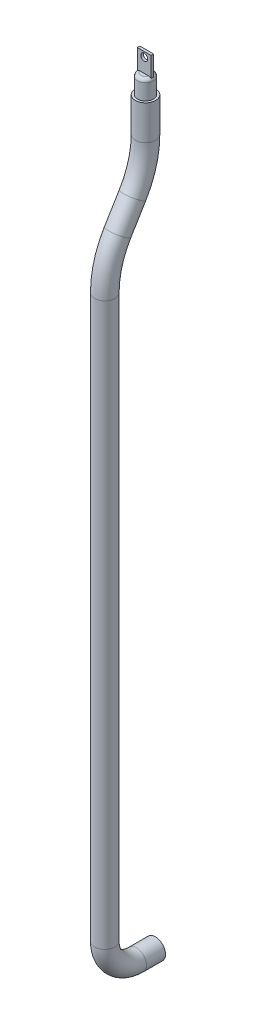
ISO-10303-21;
HEADER;
FILE_DESCRIPTION(('STEP AP214'),'2;1');
FILE_NAME('part.step','',(''),(''),'','','');
FILE_SCHEMA(('AUTOMOTIVE_DESIGN { 1 0 10303 214 1 1 1 1 }'));
ENDSEC;
DATA;
#1=APPLICATION_CONTEXT('core data for automotive mechanical design processes');
#2=APPLICATION_PROTOCOL_DEFINITION('international standard','automotive_design',2000,#1);
#3=PRODUCT_CONTEXT('',#1,'mechanical');
#4=PRODUCT('Part','Part','',(#3));
#5=PRODUCT_RELATED_PRODUCT_CATEGORY('part','',(#4));
#6=PRODUCT_DEFINITION_FORMATION('','',#4);
#7=PRODUCT_DEFINITION_CONTEXT('part definition',#1,'design');
#8=PRODUCT_DEFINITION('design','',#6,#7);
#9=PRODUCT_DEFINITION_SHAPE('','',#8);
#10=(LENGTH_UNIT() NAMED_UNIT(*) SI_UNIT(.MILLI.,.METRE.));
#11=(NAMED_UNIT(*) PLANE_ANGLE_UNIT() SI_UNIT($,.RADIAN.));
#12=(NAMED_UNIT(*) SI_UNIT($,.STERADIAN.) SOLID_ANGLE_UNIT());
#13=UNCERTAINTY_MEASURE_WITH_UNIT(LENGTH_MEASURE(1.E-05),#10,'distance_accuracy_value','');
#14=(GEOMETRIC_REPRESENTATION_CONTEXT(3) GLOBAL_UNCERTAINTY_ASSIGNED_CONTEXT((#13)) GLOBAL_UNIT_ASSIGNED_CONTEXT((#10,
#11,#12)) REPRESENTATION_CONTEXT('',''));
#15=CARTESIAN_POINT('',(0.,0.,0.));
#16=DIRECTION('',(0.,0.,1.));
#17=DIRECTION('',(1.,0.,0.));
#18=AXIS2_PLACEMENT_3D('',#15,#16,#17);
#19=CARTESIAN_POINT('',(1505.09003220834,-521.240046141747,2179.52103966599));
#20=DIRECTION('',(0.,1.,0.));
#21=DIRECTION('',(0.,0.,1.));
#22=AXIS2_PLACEMENT_3D('',#19,#20,#21);
#23=PLANE('',#22);
#24=DIRECTION('',(1.,0.,0.));
#25=VECTOR('',#24,1.);
#26=CARTESIAN_POINT('',(1516.09003220834,-521.240046141747,2181.52103966599));
#27=LINE('',#26,#25);
#28=CARTESIAN_POINT('',(1497.9005328159,-521.240046141747,2181.52103966599));
#29=VERTEX_POINT('',#28);
#30=CARTESIAN_POINT('',(1512.27953160078,-521.240046141747,2181.52103966599));
#31=VERTEX_POINT('',#30);
#32=EDGE_CURVE('E127',#29,#31,#27,.T.);
#33=ORIENTED_EDGE('',*,*,#32,.F.);
#34=CARTESIAN_POINT('',(1505.09003220834,-521.240046141747,2179.52103966599));
#35=DIRECTION('',(0.,1.,0.));
#36=DIRECTION('',(0.,0.,1.));
#37=AXIS2_PLACEMENT_3D('',#34,#35,#36);
#38=CIRCLE('',#37,7.46249968267053);
#39=EDGE_CURVE('E171',#29,#31,#38,.T.);
#40=ORIENTED_EDGE('',*,*,#39,.T.);
#41=EDGE_LOOP('',(#33,#40));
#42=FACE_BOUND('',#41,.T.);
#43=ADVANCED_FACE('F44',(#42),#23,.T.);
#44=CARTESIAN_POINT('',(1505.09003220834,-551.240046141747,2179.52103966599));
#45=DIRECTION('',(0.,1.,0.));
#46=DIRECTION('',(1.,0.,0.));
#47=AXIS2_PLACEMENT_3D('',#44,#45,#46);
#48=PLANE('',#47);
#49=CARTESIAN_POINT('',(1505.09003220834,-551.240046141747,2179.52103966599));
#50=DIRECTION('',(0.,1.,0.));
#51=DIRECTION('',(0.,0.,1.));
#52=AXIS2_PLACEMENT_3D('',#49,#50,#51);
#53=CIRCLE('',#52,12.4624996826705);
#54=CARTESIAN_POINT('',(1505.09003220834,-551.240046141747,2191.98353934866));
#55=VERTEX_POINT('',#54);
#56=EDGE_CURVE('E142',#55,#55,#53,.T.);
#57=ORIENTED_EDGE('',*,*,#56,.F.);
#58=EDGE_LOOP('',(#57));
#59=FACE_BOUND('',#58,.T.);
#60=CARTESIAN_POINT('',(1505.09003220834,-551.240046141747,2179.52103966599));
#61=DIRECTION('',(0.,1.,0.));
#62=DIRECTION('',(1.,0.,0.));
#63=AXIS2_PLACEMENT_3D('',#60,#61,#62);
#64=CIRCLE('',#63,16.);
#65=CARTESIAN_POINT('',(1521.09003220834,-551.240046141747,2179.52103966599));
#66=VERTEX_POINT('',#65);
#67=EDGE_CURVE('E146',#66,#66,#64,.T.);
#68=ORIENTED_EDGE('',*,*,#67,.T.);
#69=EDGE_LOOP('',(#68));
#70=FACE_BOUND('',#69,.T.);
#71=ADVANCED_FACE('F228',(#59,#70),#48,.T.);
#72=CARTESIAN_POINT('',(1505.09003220834,-1727.61527839752,2163.87371588675));
#73=DIRECTION('',(0.,0.,1.));
#74=DIRECTION('',(1.,0.,0.));
#75=AXIS2_PLACEMENT_3D('',#72,#73,#74);
#76=PLANE('',#75);
#77=CARTESIAN_POINT('',(1505.09003220834,-1727.61527839752,2163.87371588675));
#78=DIRECTION('',(0.,0.,1.));
#79=DIRECTION('',(1.,0.,0.));
#80=AXIS2_PLACEMENT_3D('',#77,#78,#79);
#81=CIRCLE('',#80,16.);
#82=CARTESIAN_POINT('',(1521.09003220834,-1727.61527839752,2163.87371588675));
#83=VERTEX_POINT('',#82);
#84=EDGE_CURVE('E167',#83,#83,#81,.T.);
#85=ORIENTED_EDGE('',*,*,#84,.F.);
#86=EDGE_LOOP('',(#85));
#87=FACE_BOUND('',#86,.T.);
#88=ADVANCED_FACE('F233',(#87),#76,.F.);
#89=CARTESIAN_POINT('',(1505.09003220834,-551.240046141747,2179.52103966599));
#90=DIRECTION('',(0.,-1.,0.));
#91=DIRECTION('',(0.,0.,-1.));
#92=AXIS2_PLACEMENT_3D('',#89,#90,#91);
#93=CYLINDRICAL_SURFACE('',#92,16.);
#94=CARTESIAN_POINT('',(1505.09003220834,-605.83928582164,2179.52103966599));
#95=DIRECTION('',(0.,1.,0.));
#96=DIRECTION('',(1.,0.,0.));
#97=AXIS2_PLACEMENT_3D('',#94,#95,#96);
#98=CIRCLE('',#97,16.);
#99=CARTESIAN_POINT('',(1505.09003220834,-605.83928582164,2163.52103966599));
#100=VERTEX_POINT('',#99);
#101=EDGE_CURVE('E149',#100,#100,#98,.T.);
#102=ORIENTED_EDGE('',*,*,#101,.T.);
#103=EDGE_LOOP('',(#102));
#104=FACE_BOUND('',#103,.T.);
#105=ORIENTED_EDGE('',*,*,#67,.F.);
#106=EDGE_LOOP('',(#105));
#107=FACE_BOUND('',#106,.T.);
#108=ADVANCED_FACE('F229',(#104,#107),#93,.T.);
#109=CARTESIAN_POINT('',(1505.09003220833,-605.83928582164,2319.52103966599));
#110=DIRECTION('',(-1.,0.,0.));
#111=DIRECTION('',(0.,0.,1.));
#112=AXIS2_PLACEMENT_3D('',#109,#110,#111);
#113=TOROIDAL_SURFACE('',#112,140.,16.);
#114=CARTESIAN_POINT('',(1505.09003220833,-678.52699635586,2199.86947579283));
#115=DIRECTION('',(0.,0.854654027665447,-0.519197932387282));
#116=DIRECTION('',(1.,0.,0.));
#117=AXIS2_PLACEMENT_3D('',#114,#115,#116);
#118=CIRCLE('',#117,16.);
#119=CARTESIAN_POINT('',(1505.09003220833,-686.834163274056,2186.19501135018));
#120=VERTEX_POINT('',#119);
#121=EDGE_CURVE('E152',#120,#120,#118,.T.);
#122=CARTESIAN_POINT('',(1505.09003220833,-605.83928582164,2319.52103966599));
#123=DIRECTION('',(-1.,0.,0.));
#124=DIRECTION('',(0.,0.,1.));
#125=AXIS2_PLACEMENT_3D('',#122,#123,#124);
#126=CIRCLE('',#125,156.);
#127=EDGE_CURVE('',#100,#120,#126,.T.);
#128=ORIENTED_EDGE('',*,*,#101,.F.);
#129=ORIENTED_EDGE('',*,*,#121,.T.);
#130=ORIENTED_EDGE('',*,*,#127,.T.);
#131=ORIENTED_EDGE('',*,*,#127,.F.);
#132=EDGE_LOOP('',(#128,#130,#129,#131));
#133=FACE_BOUND('',#132,.T.);
#134=ADVANCED_FACE('F232',(#133),#113,.T.);
#135=CARTESIAN_POINT('',(1505.09003220834,-678.52699635586,2199.86947579283));
#136=DIRECTION('',(0.,-0.854654027665449,0.51919793238728));
#137=DIRECTION('',(0.,-0.51919793238728,-0.854654027665449));
#138=AXIS2_PLACEMENT_3D('',#135,#136,#137);
#139=CYLINDRICAL_SURFACE('',#138,16.);
#140=CARTESIAN_POINT('',(1505.09003220834,-717.46692056775,2223.52527975991));
#141=DIRECTION('',(0.,0.854654027665449,-0.51919793238728));
#142=DIRECTION('',(1.,0.,0.));
#143=AXIS2_PLACEMENT_3D('',#140,#141,#142);
#144=CIRCLE('',#143,16.);
#145=CARTESIAN_POINT('',(1505.09003220833,-709.159753649553,2237.19974420255));
#146=VERTEX_POINT('',#145);
#147=EDGE_CURVE('E155',#146,#146,#144,.T.);
#148=ORIENTED_EDGE('',*,*,#147,.T.);
#149=EDGE_LOOP('',(#148));
#150=FACE_BOUND('',#149,.T.);
#151=ORIENTED_EDGE('',*,*,#121,.F.);
#152=EDGE_LOOP('',(#151));
#153=FACE_BOUND('',#152,.T.);
#154=ADVANCED_FACE('F237',(#150,#153),#139,.T.);
#155=CARTESIAN_POINT('',(1505.09003220834,-790.154631101969,2103.87371588675));
#156=DIRECTION('',(1.,0.,0.));
#157=DIRECTION('',(0.,0.,-1.));
#158=AXIS2_PLACEMENT_3D('',#155,#156,#157);
#159=TOROIDAL_SURFACE('',#158,140.,16.);
#160=CARTESIAN_POINT('',(1505.09003220834,-790.154631101969,2243.87371588675));
#161=DIRECTION('',(0.,1.,0.));
#162=DIRECTION('',(1.,0.,0.));
#163=AXIS2_PLACEMENT_3D('',#160,#161,#162);
#164=CIRCLE('',#163,16.);
#165=CARTESIAN_POINT('',(1505.09003220834,-790.154631101969,2259.87371588675));
#166=VERTEX_POINT('',#165);
#167=EDGE_CURVE('E158',#166,#166,#164,.T.);
#168=CARTESIAN_POINT('',(1505.09003220834,-790.154631101969,2103.87371588675));
#169=DIRECTION('',(1.,0.,0.));
#170=DIRECTION('',(0.,0.,-1.));
#171=AXIS2_PLACEMENT_3D('',#168,#169,#170);
#172=CIRCLE('',#171,156.);
#173=EDGE_CURVE('',#146,#166,#172,.T.);
#174=ORIENTED_EDGE('',*,*,#147,.F.);
#175=ORIENTED_EDGE('',*,*,#167,.T.);
#176=ORIENTED_EDGE('',*,*,#173,.T.);
#177=ORIENTED_EDGE('',*,*,#173,.F.);
#178=EDGE_LOOP('',(#174,#176,#175,#177));
#179=FACE_BOUND('',#178,.T.);
#180=ADVANCED_FACE('F241',(#179),#159,.T.);
#181=CARTESIAN_POINT('',(1505.09003220833,-790.154631101969,2243.87371588675));
#182=DIRECTION('',(0.,-1.,0.));
#183=DIRECTION('',(1.,0.,0.));
#184=AXIS2_PLACEMENT_3D('',#181,#182,#183);
#185=CYLINDRICAL_SURFACE('',#184,16.);
#186=CARTESIAN_POINT('',(1505.09003220834,-1677.61527839752,2243.87371588675));
#187=DIRECTION('',(0.,1.,0.));
#188=DIRECTION('',(1.,0.,0.));
#189=AXIS2_PLACEMENT_3D('',#186,#187,#188);
#190=CIRCLE('',#189,16.);
#191=CARTESIAN_POINT('',(1505.09003220834,-1677.61527839752,2259.87371588675));
#192=VERTEX_POINT('',#191);
#193=EDGE_CURVE('E161',#192,#192,#190,.T.);
#194=ORIENTED_EDGE('',*,*,#193,.T.);
#195=EDGE_LOOP('',(#194));
#196=FACE_BOUND('',#195,.T.);
#197=ORIENTED_EDGE('',*,*,#167,.F.);
#198=EDGE_LOOP('',(#197));
#199=FACE_BOUND('',#198,.T.);
#200=ADVANCED_FACE('F245',(#196,#199),#185,.T.);
#201=CARTESIAN_POINT('',(1505.09003220834,-1677.61527839752,2193.87371588675));
#202=DIRECTION('',(1.,0.,0.));
#203=DIRECTION('',(0.,0.,-1.));
#204=AXIS2_PLACEMENT_3D('',#201,#202,#203);
#205=TOROIDAL_SURFACE('',#204,49.9999999999998,16.);
#206=CARTESIAN_POINT('',(1505.09003220834,-1727.61527839752,2193.87371588675));
#207=DIRECTION('',(0.,0.,1.));
#208=DIRECTION('',(1.,0.,0.));
#209=AXIS2_PLACEMENT_3D('',#206,#207,#208);
#210=CIRCLE('',#209,16.);
#211=CARTESIAN_POINT('',(1505.09003220834,-1743.61527839752,2193.87371588675));
#212=VERTEX_POINT('',#211);
#213=EDGE_CURVE('E164',#212,#212,#210,.T.);
#214=CARTESIAN_POINT('',(1505.09003220834,-1677.61527839752,2193.87371588675));
#215=DIRECTION('',(1.,0.,0.));
#216=DIRECTION('',(0.,0.,-1.));
#217=AXIS2_PLACEMENT_3D('',#214,#215,#216);
#218=CIRCLE('',#217,65.9999999999998);
#219=EDGE_CURVE('',#192,#212,#218,.T.);
#220=ORIENTED_EDGE('',*,*,#193,.F.);
#221=ORIENTED_EDGE('',*,*,#213,.T.);
#222=ORIENTED_EDGE('',*,*,#219,.T.);
#223=ORIENTED_EDGE('',*,*,#219,.F.);
#224=EDGE_LOOP('',(#220,#222,#221,#223));
#225=FACE_BOUND('',#224,.T.);
#226=ADVANCED_FACE('F249',(#225),#205,.T.);
#227=CARTESIAN_POINT('',(1505.09003220834,-1727.61527839752,2193.87371588675));
#228=DIRECTION('',(0.,0.,-1.));
#229=DIRECTION('',(-1.,0.,0.));
#230=AXIS2_PLACEMENT_3D('',#227,#228,#229);
#231=CYLINDRICAL_SURFACE('',#230,16.);
#232=ORIENTED_EDGE('',*,*,#84,.T.);
#233=EDGE_LOOP('',(#232));
#234=FACE_BOUND('',#233,.T.);
#235=ORIENTED_EDGE('',*,*,#213,.F.);
#236=EDGE_LOOP('',(#235));
#237=FACE_BOUND('',#236,.T.);
#238=ADVANCED_FACE('F226',(#234,#237),#231,.T.);
#239=CARTESIAN_POINT('',(1505.09003220834,-521.240046141747,2179.52103966599));
#240=DIRECTION('',(0.,-1.,0.));
#241=DIRECTION('',(0.,0.,-1.));
#242=AXIS2_PLACEMENT_3D('',#239,#240,#241);
#243=CYLINDRICAL_SURFACE('',#242,12.4624996826705);
#244=CARTESIAN_POINT('',(1505.09003220834,-526.240046141747,2179.52103966599));
#245=DIRECTION('',(0.,1.,0.));
#246=DIRECTION('',(0.,0.,1.));
#247=AXIS2_PLACEMENT_3D('',#244,#245,#246);
#248=CIRCLE('',#247,12.4624996826705);
#249=CARTESIAN_POINT('',(1505.09003220834,-526.240046141747,2191.98353934866));
#250=VERTEX_POINT('',#249);
#251=EDGE_CURVE('E174',#250,#250,#248,.F.);
#252=ORIENTED_EDGE('',*,*,#251,.T.);
#253=EDGE_LOOP('',(#252));
#254=FACE_BOUND('',#253,.T.);
#255=ORIENTED_EDGE('',*,*,#56,.T.);
#256=EDGE_LOOP('',(#255));
#257=FACE_BOUND('',#256,.T.);
#258=ADVANCED_FACE('F222',(#254,#257),#243,.T.);
#259=DIRECTION('',(1.,0.,0.));
#260=VECTOR('',#259,1.);
#261=CARTESIAN_POINT('',(1516.09003220834,-521.240046141747,2177.52103966599));
#262=LINE('',#261,#260);
#263=CARTESIAN_POINT('',(1497.9005328159,-521.240046141747,2177.52103966599));
#264=VERTEX_POINT('',#263);
#265=CARTESIAN_POINT('',(1512.27953160078,-521.240046141747,2177.52103966599));
#266=VERTEX_POINT('',#265);
#267=EDGE_CURVE('E137',#264,#266,#262,.T.);
#268=ORIENTED_EDGE('',*,*,#267,.T.);
#269=CARTESIAN_POINT('',(1505.09003220834,-521.240046141747,2179.52103966599));
#270=DIRECTION('',(0.,1.,0.));
#271=DIRECTION('',(0.,0.,1.));
#272=AXIS2_PLACEMENT_3D('',#269,#270,#271);
#273=CIRCLE('',#272,7.46249968267053);
#274=EDGE_CURVE('E169',#266,#264,#273,.T.);
#275=ORIENTED_EDGE('',*,*,#274,.T.);
#276=EDGE_LOOP('',(#268,#275));
#277=FACE_BOUND('',#276,.T.);
#278=ADVANCED_FACE('F218',(#277),#23,.T.);
#279=CARTESIAN_POINT('',(1494.09003220834,-491.240046141747,2177.52103966599));
#280=DIRECTION('',(-1.,0.,0.));
#281=DIRECTION('',(0.,0.,1.));
#282=AXIS2_PLACEMENT_3D('',#279,#280,#281);
#283=PLANE('',#282);
#284=DIRECTION('',(0.,-1.,0.));
#285=VECTOR('',#284,1.);
#286=CARTESIAN_POINT('',(1494.09003220834,-491.240046141747,2177.52103966599));
#287=LINE('',#286,#285);
#288=CARTESIAN_POINT('',(1494.09003220834,-491.240046141747,2177.52103966599));
#289=VERTEX_POINT('',#288);
#290=CARTESIAN_POINT('',(1494.09003220834,-522.896744747712,2177.52103966599));
#291=VERTEX_POINT('',#290);
#292=EDGE_CURVE('E70',#289,#291,#287,.T.);
#293=ORIENTED_EDGE('',*,*,#292,.T.);
#294=CARTESIAN_POINT('',(1494.09003220834,-522.896744747712,2177.52103966599));
#295=CARTESIAN_POINT('',(1494.09003220834,-522.868079850711,2177.66525360418));
#296=CARTESIAN_POINT('',(1494.09003220834,-522.8429067719,2177.81013877408));
#297=CARTESIAN_POINT('',(1494.09003220834,-522.799182083621,2178.10087815217));
#298=CARTESIAN_POINT('',(1494.09003220834,-522.780629141573,2178.24673215931));
#299=CARTESIAN_POINT('',(1494.09003220834,-522.749755410663,2178.53924478151));
#300=CARTESIAN_POINT('',(1494.09003220834,-522.737441063178,2178.68590407078));
#301=CARTESIAN_POINT('',(1494.09003220834,-522.718855098255,2178.97960402014));
#302=CARTESIAN_POINT('',(1494.09003220834,-522.712583815116,2179.12664470088));
#303=CARTESIAN_POINT('',(1494.09003220834,-522.702733032429,2179.5631876573));
#304=CARTESIAN_POINT('',(1494.09003220834,-522.707624436793,2179.85291834135));
#305=CARTESIAN_POINT('',(1494.09003220834,-522.74056304714,2180.43087878731));
#306=CARTESIAN_POINT('',(1494.09003220834,-522.768590633227,2180.71910961279));
#307=CARTESIAN_POINT('',(1494.09003220834,-522.821425739803,2181.09168786679));
#308=CARTESIAN_POINT('',(1494.09003220834,-522.834790318635,2181.17772290416));
#309=CARTESIAN_POINT('',(1494.09003220834,-522.863932961985,2181.34959810684));
#310=CARTESIAN_POINT('',(1494.09003220834,-522.879716819959,2181.43543728859));
#311=CARTESIAN_POINT('',(1494.09003220834,-522.896744747712,2181.52103966599));
#312=B_SPLINE_CURVE_WITH_KNOTS('',3,(#294,#295,#296,#297,#298,#299,#300,#301,#302,#303,#304,
#305,#306,#307,#308,#309,#310,#311),.UNSPECIFIED.,.F.,.F.,(4,2,2,2,2,2,2,2,4),(0.,
0.441029170778469,0.881969515819635,1.3233642106153,1.76478332167139,2.63316613388809,
3.50081329748561,3.76198809996494,4.02379840257637),.UNSPECIFIED.);
#313=CARTESIAN_POINT('',(1494.09003220834,-522.896744747712,2181.52103966599));
#314=VERTEX_POINT('',#313);
#315=EDGE_CURVE('E57',#291,#314,#312,.T.);
#316=ORIENTED_EDGE('',*,*,#315,.T.);
#317=DIRECTION('',(0.,-1.,0.));
#318=VECTOR('',#317,1.);
#319=CARTESIAN_POINT('',(1494.09003220834,-491.240046141747,2181.52103966599));
#320=LINE('',#319,#318);
#321=CARTESIAN_POINT('',(1494.09003220834,-491.240046141747,2181.52103966599));
#322=VERTEX_POINT('',#321);
#323=EDGE_CURVE('E63',#322,#314,#320,.T.);
#324=ORIENTED_EDGE('',*,*,#323,.F.);
#325=DIRECTION('',(0.,0.,1.));
#326=VECTOR('',#325,1.);
#327=CARTESIAN_POINT('',(1494.09003220834,-491.240046141747,2177.52103966599));
#328=LINE('',#327,#326);
#329=EDGE_CURVE('E118',#289,#322,#328,.T.);
#330=ORIENTED_EDGE('',*,*,#329,.F.);
#331=EDGE_LOOP('',(#293,#316,#324,#330));
#332=FACE_BOUND('',#331,.T.);
#333=ADVANCED_FACE('F214',(#332),#283,.T.);
#334=CARTESIAN_POINT('',(1516.09003220834,-491.240046141747,2177.52103966599));
#335=DIRECTION('',(0.,1.,0.));
#336=DIRECTION('',(0.,0.,1.));
#337=AXIS2_PLACEMENT_3D('',#334,#335,#336);
#338=PLANE('',#337);
#339=ORIENTED_EDGE('',*,*,#329,.T.);
#340=DIRECTION('',(-1.,0.,0.));
#341=VECTOR('',#340,1.);
#342=CARTESIAN_POINT('',(1516.09003220834,-491.240046141747,2181.52103966599));
#343=LINE('',#342,#341);
#344=CARTESIAN_POINT('',(1516.09003220834,-491.240046141747,2181.52103966599));
#345=VERTEX_POINT('',#344);
#346=EDGE_CURVE('E123',#345,#322,#343,.T.);
#347=ORIENTED_EDGE('',*,*,#346,.F.);
#348=DIRECTION('',(0.,0.,1.));
#349=VECTOR('',#348,1.);
#350=CARTESIAN_POINT('',(1516.09003220834,-491.240046141747,2177.52103966599));
#351=LINE('',#350,#349);
#352=CARTESIAN_POINT('',(1516.09003220834,-491.240046141747,2177.52103966599));
#353=VERTEX_POINT('',#352);
#354=EDGE_CURVE('E107',#353,#345,#351,.T.);
#355=ORIENTED_EDGE('',*,*,#354,.F.);
#356=DIRECTION('',(-1.,0.,0.));
#357=VECTOR('',#356,1.);
#358=CARTESIAN_POINT('',(1516.09003220834,-491.240046141747,2177.52103966599));
#359=LINE('',#358,#357);
#360=EDGE_CURVE('E119',#353,#289,#359,.T.);
#361=ORIENTED_EDGE('',*,*,#360,.T.);
#362=EDGE_LOOP('',(#339,#347,#355,#361));
#363=FACE_BOUND('',#362,.T.);
#364=ADVANCED_FACE('F129',(#363),#338,.T.);
#365=CARTESIAN_POINT('',(1516.09003220834,-491.240046141747,2177.52103966599));
#366=DIRECTION('',(1.,0.,0.));
#367=DIRECTION('',(0.,0.,-1.));
#368=AXIS2_PLACEMENT_3D('',#365,#366,#367);
#369=PLANE('',#368);
#370=ORIENTED_EDGE('',*,*,#354,.T.);
#371=DIRECTION('',(0.,1.,0.));
#372=VECTOR('',#371,1.);
#373=CARTESIAN_POINT('',(1516.09003220834,-491.240046141747,2181.52103966599));
#374=LINE('',#373,#372);
#375=CARTESIAN_POINT('',(1516.09003220834,-522.896744747711,2181.52103966599));
#376=VERTEX_POINT('',#375);
#377=EDGE_CURVE('E111',#376,#345,#374,.T.);
#378=ORIENTED_EDGE('',*,*,#377,.F.);
#379=CARTESIAN_POINT('',(1516.09003220834,-522.896744747711,2181.52103966599));
#380=CARTESIAN_POINT('',(1516.09003220834,-522.868079850711,2181.37682572779));
#381=CARTESIAN_POINT('',(1516.09003220834,-522.842906771899,2181.23194055789));
#382=CARTESIAN_POINT('',(1516.09003220834,-522.799182083621,2180.94120117981));
#383=CARTESIAN_POINT('',(1516.09003220834,-522.780629141573,2180.79534717266));
#384=CARTESIAN_POINT('',(1516.09003220834,-522.749755410663,2180.50283455047));
#385=CARTESIAN_POINT('',(1516.09003220834,-522.737441063177,2180.3561752612));
#386=CARTESIAN_POINT('',(1516.09003220834,-522.718855098255,2180.06247531183));
#387=CARTESIAN_POINT('',(1516.09003220834,-522.712583815116,2179.9154346311));
#388=CARTESIAN_POINT('',(1516.09003220834,-522.702733032429,2179.47889167467));
#389=CARTESIAN_POINT('',(1516.09003220834,-522.707624436793,2179.18916099063));
#390=CARTESIAN_POINT('',(1516.09003220834,-522.74056304714,2178.61120054467));
#391=CARTESIAN_POINT('',(1516.09003220834,-522.768590633227,2178.32296971918));
#392=CARTESIAN_POINT('',(1516.09003220834,-522.821425739802,2177.95039146519));
#393=CARTESIAN_POINT('',(1516.09003220834,-522.834790318635,2177.86435642782));
#394=CARTESIAN_POINT('',(1516.09003220834,-522.863932961985,2177.69248122514));
#395=CARTESIAN_POINT('',(1516.09003220834,-522.879716819959,2177.60664204339));
#396=CARTESIAN_POINT('',(1516.09003220834,-522.896744747711,2177.52103966599));
#397=B_SPLINE_CURVE_WITH_KNOTS('',3,(#379,#380,#381,#382,#383,#384,#385,#386,#387,#388,#389,
#390,#391,#392,#393,#394,#395,#396),.UNSPECIFIED.,.F.,.F.,(4,2,2,2,2,2,2,2,4),(0.,
0.441029170778925,0.881969515820077,1.32336421061618,1.76478332167183,2.63316613388898,
3.50081329748605,3.76198809996494,4.02379840257635),.UNSPECIFIED.);
#398=CARTESIAN_POINT('',(1516.09003220834,-522.896744747711,2177.52103966599));
#399=VERTEX_POINT('',#398);
#400=EDGE_CURVE('E181',#376,#399,#397,.T.);
#401=ORIENTED_EDGE('',*,*,#400,.T.);
#402=DIRECTION('',(0.,1.,0.));
#403=VECTOR('',#402,1.);
#404=CARTESIAN_POINT('',(1516.09003220834,-491.240046141747,2177.52103966599));
#405=LINE('',#404,#403);
#406=EDGE_CURVE('E113',#399,#353,#405,.T.);
#407=ORIENTED_EDGE('',*,*,#406,.T.);
#408=EDGE_LOOP('',(#370,#378,#401,#407));
#409=FACE_BOUND('',#408,.T.);
#410=ADVANCED_FACE('F109',(#409),#369,.T.);
#411=CARTESIAN_POINT('',(0.,0.,2177.52103966599));
#412=DIRECTION('',(0.,0.,-1.));
#413=DIRECTION('',(-1.,0.,0.));
#414=AXIS2_PLACEMENT_3D('',#411,#412,#413);
#415=PLANE('',#414);
#416=CARTESIAN_POINT('',(1505.09003220834,-499.005171033408,2177.52103966599));
#417=DIRECTION('',(0.,0.,1.));
#418=DIRECTION('',(1.,0.,0.));
#419=AXIS2_PLACEMENT_3D('',#416,#417,#418);
#420=CIRCLE('',#419,5.50000000000007);
#421=CARTESIAN_POINT('',(1510.59003220834,-499.005171033408,2177.52103966599));
#422=VERTEX_POINT('',#421);
#423=EDGE_CURVE('E130',#422,#422,#420,.T.);
#424=ORIENTED_EDGE('',*,*,#423,.T.);
#425=EDGE_LOOP('',(#424));
#426=FACE_BOUND('',#425,.T.);
#427=ORIENTED_EDGE('',*,*,#292,.F.);
#428=ORIENTED_EDGE('',*,*,#360,.F.);
#429=ORIENTED_EDGE('',*,*,#406,.F.);
#430=CARTESIAN_POINT('',(1516.09003220834,-522.896744747711,2177.52103966599));
#431=CARTESIAN_POINT('',(1515.99366688143,-522.791287325387,2177.52103966599));
#432=CARTESIAN_POINT('',(1515.89276666829,-522.689984309483,2177.52103966599));
#433=CARTESIAN_POINT('',(1515.68272312801,-522.496344148607,2177.52103966599));
#434=CARTESIAN_POINT('',(1515.57358082259,-522.404005895558,2177.52103966599));
#435=CARTESIAN_POINT('',(1515.3480038019,-522.229040923457,2177.52103966599));
#436=CARTESIAN_POINT('',(1515.23157885727,-522.146401602913,2177.52103966599));
#437=CARTESIAN_POINT('',(1514.99218090752,-521.991232665301,2177.52103966599));
#438=CARTESIAN_POINT('',(1514.86920800028,-521.918702897203,2177.52103966599));
#439=CARTESIAN_POINT('',(1514.61759277419,-521.784193639809,2177.52103966599));
#440=CARTESIAN_POINT('',(1514.48894934843,-521.722216221974,2177.52103966599));
#441=CARTESIAN_POINT('',(1514.22694712453,-521.609190511396,2177.52103966599));
#442=CARTESIAN_POINT('',(1514.09358823267,-521.558142436,2177.52103966599));
#443=CARTESIAN_POINT('',(1513.82319996255,-521.467277567558,2177.52103966599));
#444=CARTESIAN_POINT('',(1513.6861731032,-521.42745327299,2177.52103966599));
#445=CARTESIAN_POINT('',(1513.40936464138,-521.359174982484,2177.52103966599));
#446=CARTESIAN_POINT('',(1513.269583944,-521.330717314073,2177.52103966599));
#447=CARTESIAN_POINT('',(1512.98841304445,-521.285277397955,2177.52103966599));
#448=CARTESIAN_POINT('',(1512.84702590417,-521.268276152351,2177.52103966599));
#449=CARTESIAN_POINT('',(1512.5635988026,-521.245662777539,2177.52103966599));
#450=CARTESIAN_POINT('',(1512.42156047598,-521.240030188347,2177.52103966599));
#451=CARTESIAN_POINT('',(1512.27953160078,-521.240046141747,2177.52103966599));
#452=B_SPLINE_CURVE_WITH_KNOTS('',3,(#430,#431,#432,#433,#434,#435,#436,#437,#438,#439,#440,
#441,#442,#443,#444,#445,#446,#447,#448,#449,#450,#451),.UNSPECIFIED.,.F.,.F.,(4,2,2,2,2,2,2,2,
2,2,4),(0.,0.428423057804197,0.856793093416571,1.2846002523658,1.71240101953466,
2.14028566878094,2.56817882634379,2.99578531544491,3.42325353607782,3.8500111409478,
4.27600002991388),.UNSPECIFIED.);
#453=EDGE_CURVE('E201',#399,#266,#452,.T.);
#454=ORIENTED_EDGE('',*,*,#453,.T.);
#455=ORIENTED_EDGE('',*,*,#267,.F.);
#456=CARTESIAN_POINT('',(1497.9005328159,-521.240046141747,2177.52103966599));
#457=CARTESIAN_POINT('',(1497.74178406517,-521.240021048594,2177.52103966599));
#458=CARTESIAN_POINT('',(1497.58302091762,-521.247062896669,2177.52103966599));
#459=CARTESIAN_POINT('',(1497.26671560391,-521.275308068018,2177.52103966599));
#460=CARTESIAN_POINT('',(1497.10917380046,-521.296515446329,2177.52103966599));
#461=CARTESIAN_POINT('',(1496.79644310691,-521.353157394568,2177.52103966599));
#462=CARTESIAN_POINT('',(1496.64125766797,-521.388611069245,2177.52103966599));
#463=CARTESIAN_POINT('',(1496.33481253098,-521.473581436993,2177.52103966599));
#464=CARTESIAN_POINT('',(1496.18355203901,-521.523095261425,2177.52103966599));
#465=CARTESIAN_POINT('',(1495.89629154198,-521.632082829842,2177.52103966599));
#466=CARTESIAN_POINT('',(1495.75995043742,-521.690659318861,2177.52103966599));
#467=CARTESIAN_POINT('',(1495.49287131945,-521.819429111684,2177.52103966599));
#468=CARTESIAN_POINT('',(1495.36213298707,-521.889621753055,2177.52103966599));
#469=CARTESIAN_POINT('',(1495.10761181783,-522.040970375371,2177.52103966599));
#470=CARTESIAN_POINT('',(1494.98381233359,-522.122098373221,2177.52103966599));
#471=CARTESIAN_POINT('',(1494.74385106214,-522.294858284339,2177.52103966599));
#472=CARTESIAN_POINT('',(1494.62768532353,-522.386484694943,2177.52103966599));
#473=CARTESIAN_POINT('',(1494.4407971848,-522.547739409688,2177.52103966599));
#474=CARTESIAN_POINT('',(1494.36772011765,-522.614659837493,2177.52103966599));
#475=CARTESIAN_POINT('',(1494.2257214307,-522.752640118648,2177.52103966599));
#476=CARTESIAN_POINT('',(1494.15679588031,-522.823695927227,2177.52103966599));
#477=CARTESIAN_POINT('',(1494.09003220834,-522.896744747712,2177.52103966599));
#478=B_SPLINE_CURVE_WITH_KNOTS('',3,(#456,#457,#458,#459,#460,#461,#462,#463,#464,#465,#466,
#467,#468,#469,#470,#471,#472,#473,#474,#475,#476,#477),.UNSPECIFIED.,.F.,.F.,(4,2,2,2,2,2,2,2,
2,2,4),(0.,0.47611134715372,0.952359044823101,1.42924754912486,1.90603882556608,
2.35066493946512,2.7952657064829,3.23874962616189,3.68200215135675,3.97910659298519,
4.2759251705008),.UNSPECIFIED.);
#479=EDGE_CURVE('E206',#264,#291,#478,.T.);
#480=ORIENTED_EDGE('',*,*,#479,.T.);
#481=EDGE_LOOP('',(#427,#428,#429,#454,#455,#480));
#482=FACE_BOUND('',#481,.T.);
#483=ADVANCED_FACE('F194',(#426,#482),#415,.T.);
#484=CARTESIAN_POINT('',(1505.09003220834,-499.005171033408,2177.52103966599));
#485=DIRECTION('',(0.,0.,1.));
#486=DIRECTION('',(1.,0.,0.));
#487=AXIS2_PLACEMENT_3D('',#484,#485,#486);
#488=CYLINDRICAL_SURFACE('',#487,5.50000000000007);
#489=ORIENTED_EDGE('',*,*,#423,.F.);
#490=EDGE_LOOP('',(#489));
#491=FACE_BOUND('',#490,.T.);
#492=CARTESIAN_POINT('',(1505.09003220834,-499.005171033408,2181.52103966599));
#493=DIRECTION('',(0.,0.,1.));
#494=DIRECTION('',(1.,0.,0.));
#495=AXIS2_PLACEMENT_3D('',#492,#493,#494);
#496=CIRCLE('',#495,5.50000000000007);
#497=CARTESIAN_POINT('',(1510.59003220834,-499.005171033408,2181.52103966599));
#498=VERTEX_POINT('',#497);
#499=EDGE_CURVE('E281',#498,#498,#496,.T.);
#500=ORIENTED_EDGE('',*,*,#499,.T.);
#501=EDGE_LOOP('',(#500));
#502=FACE_BOUND('',#501,.T.);
#503=ADVANCED_FACE('F190',(#491,#502),#488,.F.);
#504=CARTESIAN_POINT('',(0.,0.,2181.52103966599));
#505=DIRECTION('',(0.,0.,-1.));
#506=DIRECTION('',(-1.,0.,0.));
#507=AXIS2_PLACEMENT_3D('',#504,#505,#506);
#508=PLANE('',#507);
#509=ORIENTED_EDGE('',*,*,#323,.T.);
#510=CARTESIAN_POINT('',(1494.09003220834,-522.896744747712,2181.52103966599));
#511=CARTESIAN_POINT('',(1494.18639753524,-522.791287325388,2181.52103966599));
#512=CARTESIAN_POINT('',(1494.28729774839,-522.689984309483,2181.52103966599));
#513=CARTESIAN_POINT('',(1494.49734128867,-522.496344148607,2181.52103966599));
#514=CARTESIAN_POINT('',(1494.60648359408,-522.404005895558,2181.52103966599));
#515=CARTESIAN_POINT('',(1494.83206061477,-522.229040923457,2181.52103966599));
#516=CARTESIAN_POINT('',(1494.94848555941,-522.146401602914,2181.52103966599));
#517=CARTESIAN_POINT('',(1495.18788350915,-521.991232665301,2181.52103966599));
#518=CARTESIAN_POINT('',(1495.3108564164,-521.918702897203,2181.52103966599));
#519=CARTESIAN_POINT('',(1495.56247164249,-521.784193639809,2181.52103966599));
#520=CARTESIAN_POINT('',(1495.69111506824,-521.722216221974,2181.52103966599));
#521=CARTESIAN_POINT('',(1495.95311729215,-521.609190511396,2181.52103966599));
#522=CARTESIAN_POINT('',(1496.086476184,-521.558142436,2181.52103966599));
#523=CARTESIAN_POINT('',(1496.35686445413,-521.467277567558,2181.52103966599));
#524=CARTESIAN_POINT('',(1496.49389131348,-521.42745327299,2181.52103966599));
#525=CARTESIAN_POINT('',(1496.7706997753,-521.359174982484,2181.52103966599));
#526=CARTESIAN_POINT('',(1496.91048047267,-521.330717314073,2181.52103966599));
#527=CARTESIAN_POINT('',(1497.19165137223,-521.285277397955,2181.52103966599));
#528=CARTESIAN_POINT('',(1497.33303851251,-521.268276152351,2181.52103966599));
#529=CARTESIAN_POINT('',(1497.61646561408,-521.245662777538,2181.52103966599));
#530=CARTESIAN_POINT('',(1497.75850394069,-521.240030188347,2181.52103966599));
#531=CARTESIAN_POINT('',(1497.9005328159,-521.240046141747,2181.52103966599));
#532=B_SPLINE_CURVE_WITH_KNOTS('',3,(#510,#511,#512,#513,#514,#515,#516,#517,#518,#519,#520,
#521,#522,#523,#524,#525,#526,#527,#528,#529,#530,#531),.UNSPECIFIED.,.F.,.F.,(4,2,2,2,2,2,2,2,
2,2,4),(0.,0.428423057804511,0.856793093416644,1.2846002523658,1.71240101953473,
2.14028566878095,2.56817882634409,2.99578531544475,3.42325353607791,3.85001114094766,
4.27600002991419),.UNSPECIFIED.);
#533=EDGE_CURVE('E12',#314,#29,#532,.T.);
#534=ORIENTED_EDGE('',*,*,#533,.T.);
#535=ORIENTED_EDGE('',*,*,#32,.T.);
#536=CARTESIAN_POINT('',(1512.27953160078,-521.240046141747,2181.52103966599));
#537=CARTESIAN_POINT('',(1512.4382803515,-521.240021048594,2181.52103966599));
#538=CARTESIAN_POINT('',(1512.59704349906,-521.247062896669,2181.52103966599));
#539=CARTESIAN_POINT('',(1512.91334881276,-521.275308068018,2181.52103966599));
#540=CARTESIAN_POINT('',(1513.07089061622,-521.296515446329,2181.52103966599));
#541=CARTESIAN_POINT('',(1513.38362130976,-521.353157394568,2181.52103966599));
#542=CARTESIAN_POINT('',(1513.53880674871,-521.388611069245,2181.52103966599));
#543=CARTESIAN_POINT('',(1513.84525188569,-521.473581436993,2181.52103966599));
#544=CARTESIAN_POINT('',(1513.99651237767,-521.523095261425,2181.52103966599));
#545=CARTESIAN_POINT('',(1514.28377287469,-521.632082829842,2181.52103966599));
#546=CARTESIAN_POINT('',(1514.42011397926,-521.690659318861,2181.52103966599));
#547=CARTESIAN_POINT('',(1514.68719309723,-521.819429111684,2181.52103966599));
#548=CARTESIAN_POINT('',(1514.81793142961,-521.889621753055,2181.52103966599));
#549=CARTESIAN_POINT('',(1515.07245259885,-522.040970375371,2181.52103966599));
#550=CARTESIAN_POINT('',(1515.19625208308,-522.122098373221,2181.52103966599));
#551=CARTESIAN_POINT('',(1515.43621335454,-522.294858284339,2181.52103966599));
#552=CARTESIAN_POINT('',(1515.55237909314,-522.386484694943,2181.52103966599));
#553=CARTESIAN_POINT('',(1515.73926723187,-522.547739409687,2181.52103966599));
#554=CARTESIAN_POINT('',(1515.81234429902,-522.614659837493,2181.52103966599));
#555=CARTESIAN_POINT('',(1515.95434298598,-522.752640118648,2181.52103966599));
#556=CARTESIAN_POINT('',(1516.02326853636,-522.823695927227,2181.52103966599));
#557=CARTESIAN_POINT('',(1516.09003220834,-522.896744747711,2181.52103966599));
#558=B_SPLINE_CURVE_WITH_KNOTS('',3,(#536,#537,#538,#539,#540,#541,#542,#543,#544,#545,#546,
#547,#548,#549,#550,#551,#552,#553,#554,#555,#556,#557),.UNSPECIFIED.,.F.,.F.,(4,2,2,2,2,2,2,2,
2,2,4),(0.,0.47611134715372,0.952359044823101,1.42924754912486,1.90603882556608,
2.35066493946512,2.7952657064829,3.23874962616189,3.68200215135675,3.97910659298488,
4.27592517050049),.UNSPECIFIED.);
#559=EDGE_CURVE('E125',#31,#376,#558,.T.);
#560=ORIENTED_EDGE('',*,*,#559,.T.);
#561=ORIENTED_EDGE('',*,*,#377,.T.);
#562=ORIENTED_EDGE('',*,*,#346,.T.);
#563=EDGE_LOOP('',(#509,#534,#535,#560,#561,#562));
#564=FACE_BOUND('',#563,.T.);
#565=ORIENTED_EDGE('',*,*,#499,.F.);
#566=EDGE_LOOP('',(#565));
#567=FACE_BOUND('',#566,.T.);
#568=ADVANCED_FACE('F121',(#564,#567),#508,.F.);
#569=CARTESIAN_POINT('',(1505.09003220834,-526.240046141747,2179.52103966599));
#570=DIRECTION('',(0.,1.,0.));
#571=DIRECTION('',(0.,0.,1.));
#572=AXIS2_PLACEMENT_3D('',#569,#570,#571);
#573=TOROIDAL_SURFACE('',#572,7.46249968267053,5.);
#574=ORIENTED_EDGE('',*,*,#251,.F.);
#575=EDGE_LOOP('',(#574));
#576=FACE_BOUND('',#575,.T.);
#577=ORIENTED_EDGE('',*,*,#559,.F.);
#578=ORIENTED_EDGE('',*,*,#39,.F.);
#579=ORIENTED_EDGE('',*,*,#533,.F.);
#580=ORIENTED_EDGE('',*,*,#315,.F.);
#581=ORIENTED_EDGE('',*,*,#479,.F.);
#582=ORIENTED_EDGE('',*,*,#274,.F.);
#583=ORIENTED_EDGE('',*,*,#453,.F.);
#584=ORIENTED_EDGE('',*,*,#400,.F.);
#585=EDGE_LOOP('',(#577,#578,#579,#580,#581,#582,#583,#584));
#586=FACE_BOUND('',#585,.T.);
#587=ADVANCED_FACE('F46',(#576,#586),#573,.T.);
#588=CLOSED_SHELL('',(#43,#71,#88,#108,#134,#154,#180,#200,#226,#238,#258,#278,#333,#364,#410,
#483,#503,#568,#587));
#589=MANIFOLD_SOLID_BREP('B2',#588);
#590=ADVANCED_BREP_SHAPE_REPRESENTATION('',(#18,#589),#14);
#591=SHAPE_DEFINITION_REPRESENTATION(#9,#590);
ENDSEC;
END-ISO-10303-21;
